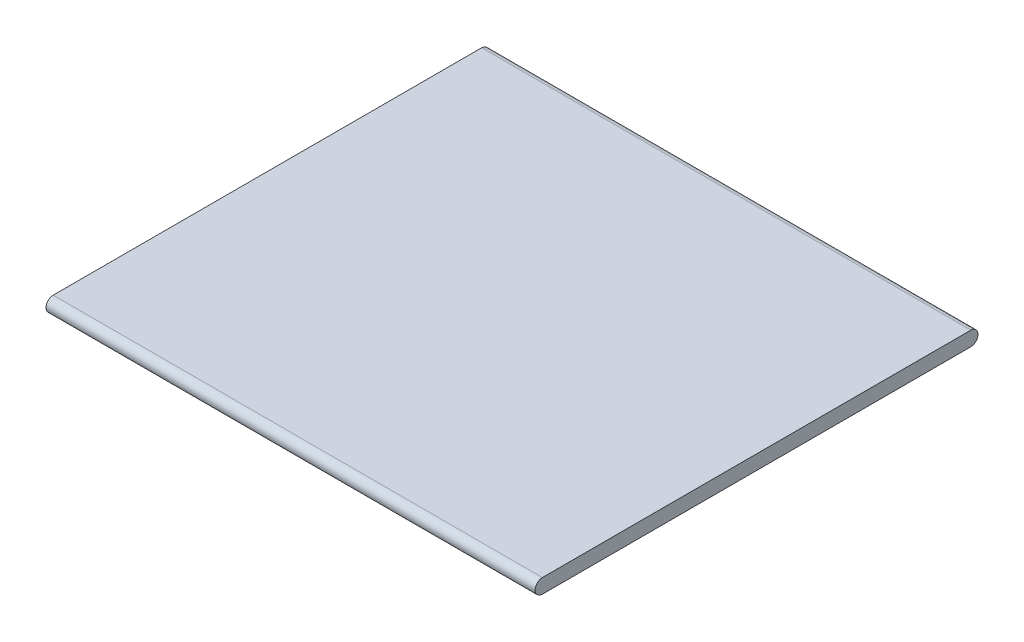
ISO-10303-21;
HEADER;
FILE_DESCRIPTION(('STEP AP214'),'2;1');
FILE_NAME('part.step','',(''),(''),'','','');
FILE_SCHEMA(('AUTOMOTIVE_DESIGN { 1 0 10303 214 1 1 1 1 }'));
ENDSEC;
DATA;
#1=APPLICATION_CONTEXT('core data for automotive mechanical design processes');
#2=APPLICATION_PROTOCOL_DEFINITION('international standard','automotive_design',2000,#1);
#3=PRODUCT_CONTEXT('',#1,'mechanical');
#4=PRODUCT('Part','Part','',(#3));
#5=PRODUCT_RELATED_PRODUCT_CATEGORY('part','',(#4));
#6=PRODUCT_DEFINITION_FORMATION('','',#4);
#7=PRODUCT_DEFINITION_CONTEXT('part definition',#1,'design');
#8=PRODUCT_DEFINITION('design','',#6,#7);
#9=PRODUCT_DEFINITION_SHAPE('','',#8);
#10=(LENGTH_UNIT() NAMED_UNIT(*) SI_UNIT(.MILLI.,.METRE.));
#11=(NAMED_UNIT(*) PLANE_ANGLE_UNIT() SI_UNIT($,.RADIAN.));
#12=(NAMED_UNIT(*) SI_UNIT($,.STERADIAN.) SOLID_ANGLE_UNIT());
#13=UNCERTAINTY_MEASURE_WITH_UNIT(LENGTH_MEASURE(1.E-05),#10,'distance_accuracy_value','');
#14=(GEOMETRIC_REPRESENTATION_CONTEXT(3) GLOBAL_UNCERTAINTY_ASSIGNED_CONTEXT((#13)) GLOBAL_UNIT_ASSIGNED_CONTEXT((#10,
#11,#12)) REPRESENTATION_CONTEXT('',''));
#15=CARTESIAN_POINT('',(0.,0.,0.));
#16=DIRECTION('',(0.,0.,1.));
#17=DIRECTION('',(1.,0.,0.));
#18=AXIS2_PLACEMENT_3D('',#15,#16,#17);
#19=CARTESIAN_POINT('',(10.,-324.281480067421,-30.));
#20=DIRECTION('',(1.,0.,0.));
#21=DIRECTION('',(0.,0.,-1.));
#22=AXIS2_PLACEMENT_3D('',#19,#20,#21);
#23=PLANE('',#22);
#24=DIRECTION('',(0.,0.,-1.));
#25=VECTOR('',#24,1.);
#26=CARTESIAN_POINT('',(10.,-314.630106088856,-27.2919792728029));
#27=LINE('',#26,#25);
#28=CARTESIAN_POINT('',(10.,-314.630106088856,-27.2919792728029));
#29=VERTEX_POINT('',#28);
#30=CARTESIAN_POINT('',(10.,-314.630106088856,-561.587294138042));
#31=VERTEX_POINT('',#30);
#32=EDGE_CURVE('E89',#29,#31,#27,.T.);
#33=ORIENTED_EDGE('',*,*,#32,.F.);
#34=CARTESIAN_POINT('',(10.,-305.630106088856,-27.2919792728029));
#35=DIRECTION('',(1.,0.,0.));
#36=DIRECTION('',(0.,0.,-1.));
#37=AXIS2_PLACEMENT_3D('',#34,#35,#36);
#38=CIRCLE('',#37,8.99999999999995);
#39=CARTESIAN_POINT('',(10.,-296.630106088856,-27.2919792728029));
#40=VERTEX_POINT('',#39);
#41=EDGE_CURVE('E111',#40,#29,#38,.T.);
#42=ORIENTED_EDGE('',*,*,#41,.F.);
#43=DIRECTION('',(0.,0.,1.));
#44=VECTOR('',#43,1.);
#45=CARTESIAN_POINT('',(10.,-296.630106088856,-561.587294138042));
#46=LINE('',#45,#44);
#47=CARTESIAN_POINT('',(10.,-296.630106088856,-561.587294138042));
#48=VERTEX_POINT('',#47);
#49=EDGE_CURVE('E57',#48,#40,#46,.T.);
#50=ORIENTED_EDGE('',*,*,#49,.F.);
#51=CARTESIAN_POINT('',(10.,-305.630106088856,-561.587294138042));
#52=DIRECTION('',(1.,0.,0.));
#53=DIRECTION('',(0.,0.,-1.));
#54=AXIS2_PLACEMENT_3D('',#51,#52,#53);
#55=CIRCLE('',#54,9.00000000000001);
#56=EDGE_CURVE('E51',#31,#48,#55,.T.);
#57=ORIENTED_EDGE('',*,*,#56,.F.);
#58=EDGE_LOOP('',(#33,#42,#50,#57));
#59=FACE_BOUND('',#58,.T.);
#60=ADVANCED_FACE('F37',(#59),#23,.F.);
#61=CARTESIAN_POINT('',(620.,-296.630106088856,-561.587294138042));
#62=DIRECTION('',(0.,-1.,0.));
#63=DIRECTION('',(0.,0.,-1.));
#64=AXIS2_PLACEMENT_3D('',#61,#62,#63);
#65=PLANE('',#64);
#66=ORIENTED_EDGE('',*,*,#49,.T.);
#67=DIRECTION('',(-1.,0.,0.));
#68=VECTOR('',#67,1.);
#69=CARTESIAN_POINT('',(620.,-296.630106088856,-27.2919792728029));
#70=LINE('',#69,#68);
#71=CARTESIAN_POINT('',(620.,-296.630106088856,-27.2919792728029));
#72=VERTEX_POINT('',#71);
#73=EDGE_CURVE('E44',#72,#40,#70,.T.);
#74=ORIENTED_EDGE('',*,*,#73,.F.);
#75=DIRECTION('',(0.,0.,1.));
#76=VECTOR('',#75,1.);
#77=CARTESIAN_POINT('',(620.,-296.630106088856,-561.587294138042));
#78=LINE('',#77,#76);
#79=CARTESIAN_POINT('',(620.,-296.630106088856,-561.587294138042));
#80=VERTEX_POINT('',#79);
#81=EDGE_CURVE('E75',#80,#72,#78,.T.);
#82=ORIENTED_EDGE('',*,*,#81,.F.);
#83=DIRECTION('',(-1.,0.,0.));
#84=VECTOR('',#83,1.);
#85=CARTESIAN_POINT('',(620.,-296.630106088856,-561.587294138042));
#86=LINE('',#85,#84);
#87=EDGE_CURVE('E12',#80,#48,#86,.T.);
#88=ORIENTED_EDGE('',*,*,#87,.T.);
#89=EDGE_LOOP('',(#66,#74,#82,#88));
#90=FACE_BOUND('',#89,.T.);
#91=ADVANCED_FACE('F77',(#90),#65,.F.);
#92=CARTESIAN_POINT('',(620.,-305.630106088856,-27.2919792728029));
#93=DIRECTION('',(-1.,0.,0.));
#94=DIRECTION('',(0.,0.,1.));
#95=AXIS2_PLACEMENT_3D('',#92,#93,#94);
#96=CYLINDRICAL_SURFACE('',#95,8.99999999999995);
#97=ORIENTED_EDGE('',*,*,#41,.T.);
#98=DIRECTION('',(-1.,0.,0.));
#99=VECTOR('',#98,1.);
#100=CARTESIAN_POINT('',(620.,-314.630106088856,-27.2919792728029));
#101=LINE('',#100,#99);
#102=CARTESIAN_POINT('',(620.,-314.630106088856,-27.2919792728029));
#103=VERTEX_POINT('',#102);
#104=EDGE_CURVE('E114',#103,#29,#101,.T.);
#105=ORIENTED_EDGE('',*,*,#104,.F.);
#106=CARTESIAN_POINT('',(620.,-305.630106088856,-27.2919792728029));
#107=DIRECTION('',(1.,0.,0.));
#108=DIRECTION('',(0.,0.,-1.));
#109=AXIS2_PLACEMENT_3D('',#106,#107,#108);
#110=CIRCLE('',#109,8.99999999999995);
#111=EDGE_CURVE('E81',#72,#103,#110,.T.);
#112=ORIENTED_EDGE('',*,*,#111,.F.);
#113=ORIENTED_EDGE('',*,*,#73,.T.);
#114=EDGE_LOOP('',(#97,#105,#112,#113));
#115=FACE_BOUND('',#114,.T.);
#116=ADVANCED_FACE('F100',(#115),#96,.T.);
#117=CARTESIAN_POINT('',(620.,-305.630106088856,-561.587294138042));
#118=DIRECTION('',(1.,0.,0.));
#119=DIRECTION('',(0.,0.,-1.));
#120=AXIS2_PLACEMENT_3D('',#117,#118,#119);
#121=PLANE('',#120);
#122=CARTESIAN_POINT('',(620.,-305.630106088856,-561.587294138042));
#123=DIRECTION('',(1.,0.,0.));
#124=DIRECTION('',(0.,0.,-1.));
#125=AXIS2_PLACEMENT_3D('',#122,#123,#124);
#126=CIRCLE('',#125,9.00000000000001);
#127=CARTESIAN_POINT('',(620.,-314.630106088856,-561.587294138042));
#128=VERTEX_POINT('',#127);
#129=EDGE_CURVE('E82',#128,#80,#126,.T.);
#130=ORIENTED_EDGE('',*,*,#129,.T.);
#131=ORIENTED_EDGE('',*,*,#81,.T.);
#132=ORIENTED_EDGE('',*,*,#111,.T.);
#133=DIRECTION('',(0.,0.,-1.));
#134=VECTOR('',#133,1.);
#135=CARTESIAN_POINT('',(620.,-314.630106088856,-27.2919792728029));
#136=LINE('',#135,#134);
#137=EDGE_CURVE('E87',#103,#128,#136,.T.);
#138=ORIENTED_EDGE('',*,*,#137,.T.);
#139=EDGE_LOOP('',(#130,#131,#132,#138));
#140=FACE_BOUND('',#139,.T.);
#141=ADVANCED_FACE('F85',(#140),#121,.T.);
#142=CARTESIAN_POINT('',(620.,-305.630106088856,-561.587294138042));
#143=DIRECTION('',(-1.,0.,0.));
#144=DIRECTION('',(0.,0.,1.));
#145=AXIS2_PLACEMENT_3D('',#142,#143,#144);
#146=CYLINDRICAL_SURFACE('',#145,9.00000000000001);
#147=ORIENTED_EDGE('',*,*,#56,.T.);
#148=ORIENTED_EDGE('',*,*,#87,.F.);
#149=ORIENTED_EDGE('',*,*,#129,.F.);
#150=DIRECTION('',(-1.,0.,0.));
#151=VECTOR('',#150,1.);
#152=CARTESIAN_POINT('',(620.,-314.630106088856,-561.587294138042));
#153=LINE('',#152,#151);
#154=EDGE_CURVE('E116',#128,#31,#153,.T.);
#155=ORIENTED_EDGE('',*,*,#154,.T.);
#156=EDGE_LOOP('',(#147,#148,#149,#155));
#157=FACE_BOUND('',#156,.T.);
#158=ADVANCED_FACE('F91',(#157),#146,.T.);
#159=CARTESIAN_POINT('',(620.,-314.630106088856,-27.2919792728029));
#160=DIRECTION('',(0.,1.,0.));
#161=DIRECTION('',(0.,0.,1.));
#162=AXIS2_PLACEMENT_3D('',#159,#160,#161);
#163=PLANE('',#162);
#164=ORIENTED_EDGE('',*,*,#32,.T.);
#165=ORIENTED_EDGE('',*,*,#154,.F.);
#166=ORIENTED_EDGE('',*,*,#137,.F.);
#167=ORIENTED_EDGE('',*,*,#104,.T.);
#168=EDGE_LOOP('',(#164,#165,#166,#167));
#169=FACE_BOUND('',#168,.T.);
#170=ADVANCED_FACE('F93',(#169),#163,.F.);
#171=CLOSED_SHELL('',(#60,#91,#116,#141,#158,#170));
#172=MANIFOLD_SOLID_BREP('B2',#171);
#173=ADVANCED_BREP_SHAPE_REPRESENTATION('',(#18,#172),#14);
#174=SHAPE_DEFINITION_REPRESENTATION(#9,#173);
ENDSEC;
END-ISO-10303-21;
